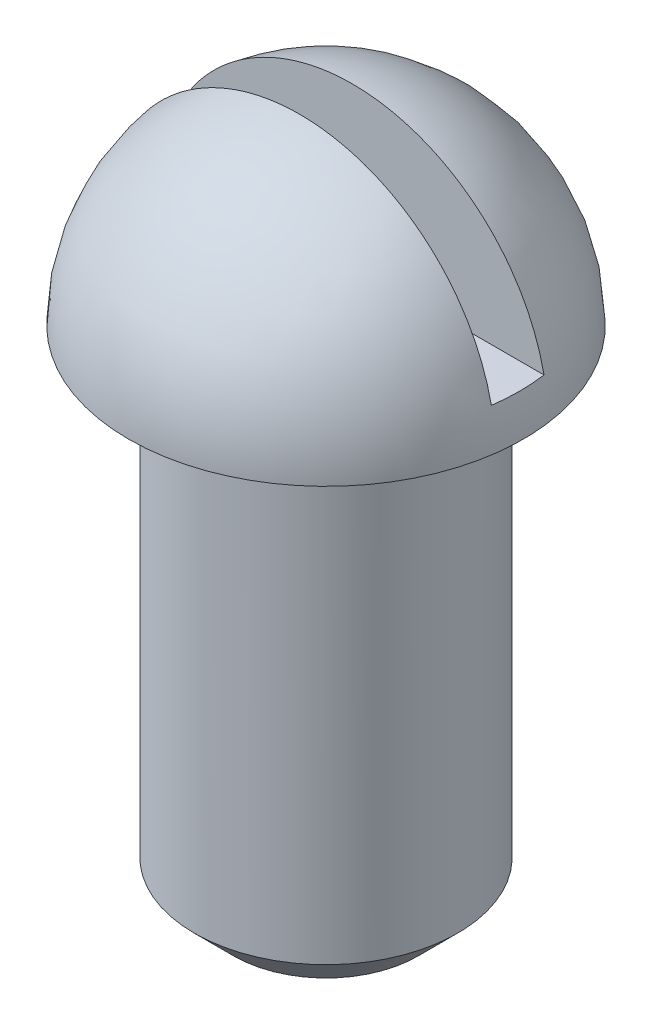
ISO-10303-21;
HEADER;
FILE_DESCRIPTION(('STEP AP214'),'2;1');
FILE_NAME('part.step','',(''),(''),'','','');
FILE_SCHEMA(('AUTOMOTIVE_DESIGN { 1 0 10303 214 1 1 1 1 }'));
ENDSEC;
DATA;
#1=APPLICATION_CONTEXT('core data for automotive mechanical design processes');
#2=APPLICATION_PROTOCOL_DEFINITION('international standard','automotive_design',2000,#1);
#3=PRODUCT_CONTEXT('',#1,'mechanical');
#4=PRODUCT('Part','Part','',(#3));
#5=PRODUCT_RELATED_PRODUCT_CATEGORY('part','',(#4));
#6=PRODUCT_DEFINITION_FORMATION('','',#4);
#7=PRODUCT_DEFINITION_CONTEXT('part definition',#1,'design');
#8=PRODUCT_DEFINITION('design','',#6,#7);
#9=PRODUCT_DEFINITION_SHAPE('','',#8);
#10=(LENGTH_UNIT() NAMED_UNIT(*) SI_UNIT(.MILLI.,.METRE.));
#11=(NAMED_UNIT(*) PLANE_ANGLE_UNIT() SI_UNIT($,.RADIAN.));
#12=(NAMED_UNIT(*) SI_UNIT($,.STERADIAN.) SOLID_ANGLE_UNIT());
#13=UNCERTAINTY_MEASURE_WITH_UNIT(LENGTH_MEASURE(1.E-05),#10,'distance_accuracy_value','');
#14=(GEOMETRIC_REPRESENTATION_CONTEXT(3) GLOBAL_UNCERTAINTY_ASSIGNED_CONTEXT((#13)) GLOBAL_UNIT_ASSIGNED_CONTEXT((#10,
#11,#12)) REPRESENTATION_CONTEXT('',''));
#15=CARTESIAN_POINT('',(0.,0.,0.));
#16=DIRECTION('',(0.,0.,1.));
#17=DIRECTION('',(1.,0.,0.));
#18=AXIS2_PLACEMENT_3D('',#15,#16,#17);
#19=CARTESIAN_POINT('',(0.,0.,0.));
#20=DIRECTION('',(0.,-1.,0.));
#21=DIRECTION('',(0.,0.,-1.));
#22=AXIS2_PLACEMENT_3D('',#19,#20,#21);
#23=SPHERICAL_SURFACE('',#22,15.);
#24=CARTESIAN_POINT('',(0.,3.,0.));
#25=DIRECTION('',(0.,-1.,0.));
#26=DIRECTION('',(0.,0.,-1.));
#27=AXIS2_PLACEMENT_3D('',#24,#25,#26);
#28=CIRCLE('',#27,14.6969384566991);
#29=CARTESIAN_POINT('',(-14.560219778561,3.,-2.));
#30=VERTEX_POINT('',#29);
#31=CARTESIAN_POINT('',(-14.560219778561,3.,2.));
#32=VERTEX_POINT('',#31);
#33=EDGE_CURVE('E53',#30,#32,#28,.F.);
#34=ORIENTED_EDGE('',*,*,#33,.F.);
#35=CARTESIAN_POINT('',(0.,0.,-2.));
#36=DIRECTION('',(0.,0.,-1.));
#37=DIRECTION('',(0.,1.,0.));
#38=AXIS2_PLACEMENT_3D('',#35,#36,#37);
#39=CIRCLE('',#38,14.8660687473185);
#40=CARTESIAN_POINT('',(14.560219778561,3.,-2.));
#41=VERTEX_POINT('',#40);
#42=EDGE_CURVE('E61',#41,#30,#39,.F.);
#43=ORIENTED_EDGE('',*,*,#42,.F.);
#44=CARTESIAN_POINT('',(14.560219778561,3.,2.));
#45=VERTEX_POINT('',#44);
#46=EDGE_CURVE('E67',#45,#41,#28,.F.);
#47=ORIENTED_EDGE('',*,*,#46,.F.);
#48=CARTESIAN_POINT('',(0.,0.,2.));
#49=DIRECTION('',(0.,0.,1.));
#50=DIRECTION('',(0.,-1.,0.));
#51=AXIS2_PLACEMENT_3D('',#48,#49,#50);
#52=CIRCLE('',#51,14.8660687473185);
#53=EDGE_CURVE('E66',#32,#45,#52,.F.);
#54=ORIENTED_EDGE('',*,*,#53,.F.);
#55=EDGE_LOOP('',(#34,#43,#47,#54));
#56=FACE_BOUND('',#55,.T.);
#57=CARTESIAN_POINT('',(0.,0.,0.));
#58=DIRECTION('',(0.,-1.,0.));
#59=DIRECTION('',(0.,0.,-1.));
#60=AXIS2_PLACEMENT_3D('',#57,#58,#59);
#61=CIRCLE('',#60,15.);
#62=CARTESIAN_POINT('',(0.,0.,-15.));
#63=VERTEX_POINT('',#62);
#64=EDGE_CURVE('E70',#63,#63,#61,.T.);
#65=ORIENTED_EDGE('',*,*,#64,.F.);
#66=EDGE_LOOP('',(#65));
#67=FACE_BOUND('',#66,.T.);
#68=ADVANCED_FACE('F33',(#56,#67),#23,.T.);
#69=CARTESIAN_POINT('',(0.,-38.,-10.));
#70=DIRECTION('',(0.,-1.,0.));
#71=DIRECTION('',(0.,0.,-1.));
#72=AXIS2_PLACEMENT_3D('',#69,#70,#71);
#73=PLANE('',#72);
#74=CARTESIAN_POINT('',(0.,-38.,0.));
#75=DIRECTION('',(0.,-1.,0.));
#76=DIRECTION('',(0.,0.,-1.));
#77=AXIS2_PLACEMENT_3D('',#74,#75,#76);
#78=CIRCLE('',#77,6.99999999999999);
#79=CARTESIAN_POINT('',(0.,-38.,6.99999999999999));
#80=VERTEX_POINT('',#79);
#81=EDGE_CURVE('E41',#80,#80,#78,.T.);
#82=ORIENTED_EDGE('',*,*,#81,.T.);
#83=EDGE_LOOP('',(#82));
#84=FACE_BOUND('',#83,.T.);
#85=ADVANCED_FACE('F90',(#84),#73,.T.);
#86=CARTESIAN_POINT('',(0.,-38.,0.));
#87=DIRECTION('',(0.,-1.,0.));
#88=DIRECTION('',(0.,0.,-1.));
#89=AXIS2_PLACEMENT_3D('',#86,#87,#88);
#90=CYLINDRICAL_SURFACE('',#89,9.99999999999999);
#91=CARTESIAN_POINT('',(0.,-35.,0.));
#92=DIRECTION('',(0.,-1.,0.));
#93=DIRECTION('',(0.,0.,-1.));
#94=AXIS2_PLACEMENT_3D('',#91,#92,#93);
#95=CIRCLE('',#94,9.99999999999999);
#96=CARTESIAN_POINT('',(0.,-35.,10.));
#97=VERTEX_POINT('',#96);
#98=EDGE_CURVE('E11',#97,#97,#95,.F.);
#99=ORIENTED_EDGE('',*,*,#98,.T.);
#100=EDGE_LOOP('',(#99));
#101=FACE_BOUND('',#100,.T.);
#102=CARTESIAN_POINT('',(0.,0.,0.));
#103=DIRECTION('',(0.,-1.,0.));
#104=DIRECTION('',(0.,0.,-1.));
#105=AXIS2_PLACEMENT_3D('',#102,#103,#104);
#106=CIRCLE('',#105,9.99999999999999);
#107=CARTESIAN_POINT('',(0.,0.,-9.99999999999999));
#108=VERTEX_POINT('',#107);
#109=EDGE_CURVE('E78',#108,#108,#106,.T.);
#110=ORIENTED_EDGE('',*,*,#109,.T.);
#111=EDGE_LOOP('',(#110));
#112=FACE_BOUND('',#111,.T.);
#113=ADVANCED_FACE('F94',(#101,#112),#90,.T.);
#114=CARTESIAN_POINT('',(0.,0.,-15.));
#115=DIRECTION('',(0.,-1.,0.));
#116=DIRECTION('',(0.,0.,-1.));
#117=AXIS2_PLACEMENT_3D('',#114,#115,#116);
#118=PLANE('',#117);
#119=ORIENTED_EDGE('',*,*,#64,.T.);
#120=EDGE_LOOP('',(#119));
#121=FACE_BOUND('',#120,.T.);
#122=ORIENTED_EDGE('',*,*,#109,.F.);
#123=EDGE_LOOP('',(#122));
#124=FACE_BOUND('',#123,.T.);
#125=ADVANCED_FACE('F87',(#121,#124),#118,.T.);
#126=CARTESIAN_POINT('',(-15.,18.,2.));
#127=DIRECTION('',(0.,0.,1.));
#128=DIRECTION('',(0.,-1.,0.));
#129=AXIS2_PLACEMENT_3D('',#126,#127,#128);
#130=PLANE('',#129);
#131=ORIENTED_EDGE('',*,*,#53,.T.);
#132=DIRECTION('',(1.,0.,0.));
#133=VECTOR('',#132,1.);
#134=CARTESIAN_POINT('',(-15.,3.,2.));
#135=LINE('',#134,#133);
#136=EDGE_CURVE('E48',#32,#45,#135,.T.);
#137=ORIENTED_EDGE('',*,*,#136,.F.);
#138=EDGE_LOOP('',(#131,#137));
#139=FACE_BOUND('',#138,.T.);
#140=ADVANCED_FACE('F103',(#139),#130,.F.);
#141=CARTESIAN_POINT('',(-15.,18.,-2.));
#142=DIRECTION('',(0.,0.,-1.));
#143=DIRECTION('',(0.,1.,0.));
#144=AXIS2_PLACEMENT_3D('',#141,#142,#143);
#145=PLANE('',#144);
#146=ORIENTED_EDGE('',*,*,#42,.T.);
#147=DIRECTION('',(1.,0.,0.));
#148=VECTOR('',#147,1.);
#149=CARTESIAN_POINT('',(-15.,3.,-2.));
#150=LINE('',#149,#148);
#151=EDGE_CURVE('E63',#30,#41,#150,.T.);
#152=ORIENTED_EDGE('',*,*,#151,.T.);
#153=EDGE_LOOP('',(#146,#152));
#154=FACE_BOUND('',#153,.T.);
#155=ADVANCED_FACE('F62',(#154),#145,.F.);
#156=CARTESIAN_POINT('',(-15.,3.,2.));
#157=DIRECTION('',(0.,-1.,0.));
#158=DIRECTION('',(0.,0.,-1.));
#159=AXIS2_PLACEMENT_3D('',#156,#157,#158);
#160=PLANE('',#159);
#161=ORIENTED_EDGE('',*,*,#33,.T.);
#162=ORIENTED_EDGE('',*,*,#136,.T.);
#163=ORIENTED_EDGE('',*,*,#46,.T.);
#164=ORIENTED_EDGE('',*,*,#151,.F.);
#165=EDGE_LOOP('',(#161,#162,#163,#164));
#166=FACE_BOUND('',#165,.T.);
#167=ADVANCED_FACE('F69',(#166),#160,.F.);
#168=CARTESIAN_POINT('',(0.,-38.,0.));
#169=DIRECTION('',(0.,1.,0.));
#170=DIRECTION('',(0.,0.,1.));
#171=AXIS2_PLACEMENT_3D('',#168,#169,#170);
#172=CONICAL_SURFACE('',#171,6.99999999999999,0.785398163397446);
#173=CARTESIAN_POINT('',(0.,-35.,10.));
#174=CARTESIAN_POINT('',(0.,-35.03125,9.96875));
#175=CARTESIAN_POINT('',(0.,-35.0625,9.9375));
#176=CARTESIAN_POINT('',(0.,-35.125,9.875));
#177=CARTESIAN_POINT('',(0.,-35.15625,9.84375));
#178=CARTESIAN_POINT('',(0.,-35.21875,9.78125));
#179=CARTESIAN_POINT('',(0.,-35.25,9.75));
#180=CARTESIAN_POINT('',(0.,-35.3125,9.6875));
#181=CARTESIAN_POINT('',(0.,-35.34375,9.65625));
#182=CARTESIAN_POINT('',(0.,-35.40625,9.59375));
#183=CARTESIAN_POINT('',(0.,-35.4375,9.5625));
#184=CARTESIAN_POINT('',(0.,-35.5,9.5));
#185=CARTESIAN_POINT('',(0.,-35.53125,9.46875));
#186=CARTESIAN_POINT('',(0.,-35.59375,9.40625));
#187=CARTESIAN_POINT('',(0.,-35.625,9.375));
#188=CARTESIAN_POINT('',(0.,-35.6875,9.3125));
#189=CARTESIAN_POINT('',(0.,-35.71875,9.28125));
#190=CARTESIAN_POINT('',(0.,-35.78125,9.21875));
#191=CARTESIAN_POINT('',(0.,-35.8125,9.1875));
#192=CARTESIAN_POINT('',(0.,-35.875,9.125));
#193=CARTESIAN_POINT('',(0.,-35.90625,9.09375));
#194=CARTESIAN_POINT('',(0.,-35.96875,9.03125));
#195=CARTESIAN_POINT('',(0.,-36.,9.));
#196=CARTESIAN_POINT('',(0.,-36.0625,8.9375));
#197=CARTESIAN_POINT('',(0.,-36.09375,8.90625));
#198=CARTESIAN_POINT('',(0.,-36.15625,8.84375));
#199=CARTESIAN_POINT('',(0.,-36.1875,8.8125));
#200=CARTESIAN_POINT('',(0.,-36.25,8.75));
#201=CARTESIAN_POINT('',(0.,-36.28125,8.71875));
#202=CARTESIAN_POINT('',(0.,-36.34375,8.65624999999999));
#203=CARTESIAN_POINT('',(0.,-36.375,8.62499999999999));
#204=CARTESIAN_POINT('',(0.,-36.4375,8.56249999999999));
#205=CARTESIAN_POINT('',(0.,-36.46875,8.53124999999999));
#206=CARTESIAN_POINT('',(0.,-36.53125,8.46874999999999));
#207=CARTESIAN_POINT('',(0.,-36.5625,8.43749999999999));
#208=CARTESIAN_POINT('',(0.,-36.625,8.37499999999999));
#209=CARTESIAN_POINT('',(0.,-36.65625,8.34374999999999));
#210=CARTESIAN_POINT('',(0.,-36.71875,8.28124999999999));
#211=CARTESIAN_POINT('',(0.,-36.75,8.24999999999999));
#212=CARTESIAN_POINT('',(0.,-36.8125,8.18749999999999));
#213=CARTESIAN_POINT('',(0.,-36.84375,8.15624999999999));
#214=CARTESIAN_POINT('',(0.,-36.90625,8.09374999999999));
#215=CARTESIAN_POINT('',(0.,-36.9375,8.06249999999999));
#216=CARTESIAN_POINT('',(0.,-37.,7.99999999999999));
#217=CARTESIAN_POINT('',(0.,-37.03125,7.96874999999999));
#218=CARTESIAN_POINT('',(0.,-37.09375,7.90624999999999));
#219=CARTESIAN_POINT('',(0.,-37.125,7.87499999999999));
#220=CARTESIAN_POINT('',(0.,-37.1875,7.81249999999999));
#221=CARTESIAN_POINT('',(0.,-37.21875,7.78124999999999));
#222=CARTESIAN_POINT('',(0.,-37.28125,7.71874999999999));
#223=CARTESIAN_POINT('',(0.,-37.3125,7.68749999999999));
#224=CARTESIAN_POINT('',(0.,-37.375,7.62499999999999));
#225=CARTESIAN_POINT('',(0.,-37.40625,7.59374999999999));
#226=CARTESIAN_POINT('',(0.,-37.46875,7.53124999999999));
#227=CARTESIAN_POINT('',(0.,-37.5,7.49999999999999));
#228=CARTESIAN_POINT('',(0.,-37.5625,7.43749999999999));
#229=CARTESIAN_POINT('',(0.,-37.59375,7.40624999999999));
#230=CARTESIAN_POINT('',(0.,-37.65625,7.34374999999999));
#231=CARTESIAN_POINT('',(0.,-37.6875,7.31249999999999));
#232=CARTESIAN_POINT('',(0.,-37.75,7.24999999999999));
#233=CARTESIAN_POINT('',(0.,-37.78125,7.21874999999999));
#234=CARTESIAN_POINT('',(0.,-37.84375,7.15624999999999));
#235=CARTESIAN_POINT('',(0.,-37.875,7.12499999999999));
#236=CARTESIAN_POINT('',(0.,-37.9375,7.06249999999999));
#237=CARTESIAN_POINT('',(0.,-37.96875,7.03124999999999));
#238=CARTESIAN_POINT('',(0.,-38.,6.99999999999999));
#239=B_SPLINE_CURVE_WITH_KNOTS('',3,(#173,#174,#175,#176,#177,#178,#179,#180,#181,#182,#183,
#184,#185,#186,#187,#188,#189,#190,#191,#192,#193,#194,#195,#196,#197,#198,#199,#200,#201,#202,
#203,#204,#205,#206,#207,#208,#209,#210,#211,#212,#213,#214,#215,#216,#217,#218,#219,#220,#221,
#222,#223,#224,#225,#226,#227,#228,#229,#230,#231,#232,#233,#234,#235,#236,#237,#238),
.UNSPECIFIED.,.F.,.F.,(4,2,2,2,2,2,2,2,2,2,2,2,2,2,2,2,2,2,2,2,2,2,2,2,2,2,2,2,2,2,2,2,4),(0.,
0.132582521472475,0.265165042944956,0.397747564417431,0.530330085889911,0.662912607362393,
0.795495128834868,0.928077650307348,1.06066017177982,1.1932426932523,1.32582521472478,
1.45840773619726,1.59099025766974,1.72357277914222,1.8561553006147,1.98873782208717,
2.12132034355965,2.25390286503213,2.38648538650461,2.51906790797709,2.65165042944956,
2.78423295092204,2.91681547239452,3.049397993867,3.18198051533948,3.31456303681196,
3.44714555828444,3.57972807975692,3.71231060122939,3.84489312270187,3.97747564417435,
4.11005816564683,4.24264068711931),.UNSPECIFIED.);
#240=EDGE_CURVE('BSEAM35',#97,#80,#239,.T.);
#241=ORIENTED_EDGE('',*,*,#98,.F.);
#242=ORIENTED_EDGE('',*,*,#81,.F.);
#243=ORIENTED_EDGE('',*,*,#240,.T.);
#244=ORIENTED_EDGE('',*,*,#240,.F.);
#245=EDGE_LOOP('',(#241,#243,#242,#244));
#246=FACE_BOUND('',#245,.T.);
#247=ADVANCED_FACE('F35',(#246),#172,.T.);
#248=CLOSED_SHELL('',(#68,#85,#113,#125,#140,#155,#167,#247));
#249=MANIFOLD_SOLID_BREP('B2',#248);
#250=ADVANCED_BREP_SHAPE_REPRESENTATION('',(#18,#249),#14);
#251=SHAPE_DEFINITION_REPRESENTATION(#9,#250);
ENDSEC;
END-ISO-10303-21;
